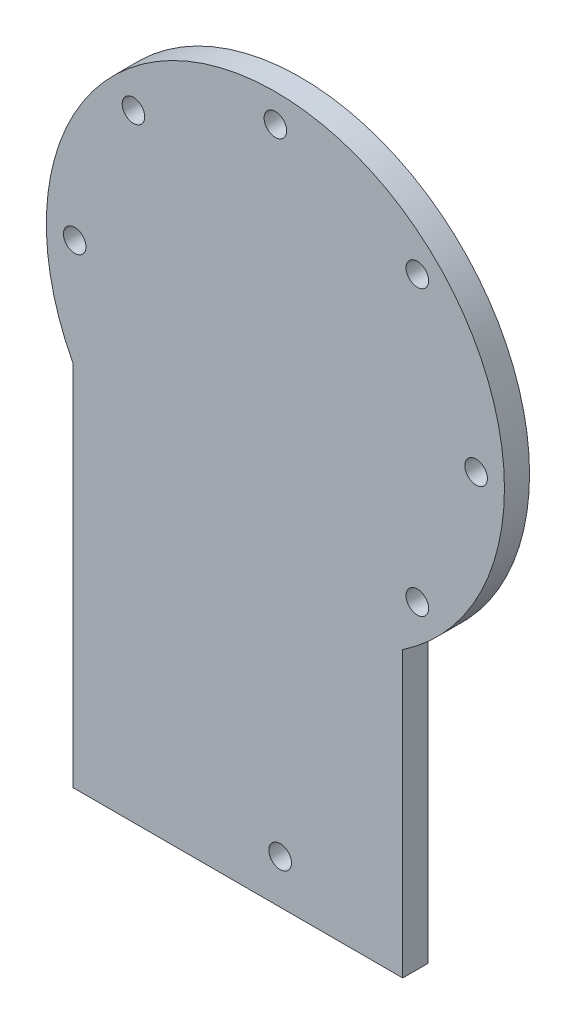
ISO-10303-21;
HEADER;
FILE_DESCRIPTION(('STEP AP214'),'2;1');
FILE_NAME('part.step','',(''),(''),'','','');
FILE_SCHEMA(('AUTOMOTIVE_DESIGN { 1 0 10303 214 1 1 1 1 }'));
ENDSEC;
DATA;
#1=APPLICATION_CONTEXT('core data for automotive mechanical design processes');
#2=APPLICATION_PROTOCOL_DEFINITION('international standard','automotive_design',2000,#1);
#3=PRODUCT_CONTEXT('',#1,'mechanical');
#4=PRODUCT('Part','Part','',(#3));
#5=PRODUCT_RELATED_PRODUCT_CATEGORY('part','',(#4));
#6=PRODUCT_DEFINITION_FORMATION('','',#4);
#7=PRODUCT_DEFINITION_CONTEXT('part definition',#1,'design');
#8=PRODUCT_DEFINITION('design','',#6,#7);
#9=PRODUCT_DEFINITION_SHAPE('','',#8);
#10=(LENGTH_UNIT() NAMED_UNIT(*) SI_UNIT(.MILLI.,.METRE.));
#11=(NAMED_UNIT(*) PLANE_ANGLE_UNIT() SI_UNIT($,.RADIAN.));
#12=(NAMED_UNIT(*) SI_UNIT($,.STERADIAN.) SOLID_ANGLE_UNIT());
#13=UNCERTAINTY_MEASURE_WITH_UNIT(LENGTH_MEASURE(1.E-05),#10,'distance_accuracy_value','');
#14=(GEOMETRIC_REPRESENTATION_CONTEXT(3) GLOBAL_UNCERTAINTY_ASSIGNED_CONTEXT((#13)) GLOBAL_UNIT_ASSIGNED_CONTEXT((#10,
#11,#12)) REPRESENTATION_CONTEXT('',''));
#15=CARTESIAN_POINT('',(0.,0.,0.));
#16=DIRECTION('',(0.,0.,1.));
#17=DIRECTION('',(1.,0.,0.));
#18=AXIS2_PLACEMENT_3D('',#15,#16,#17);
#19=CARTESIAN_POINT('',(-6.15000000000089,-6.15000000000047,2.));
#20=DIRECTION('',(0.,0.,-1.));
#21=DIRECTION('',(-1.,0.,0.));
#22=AXIS2_PLACEMENT_3D('',#19,#20,#21);
#23=CYLINDRICAL_SURFACE('',#22,18.2588849173052);
#24=CARTESIAN_POINT('',(-6.15000000000089,-6.15000000000047,0.));
#25=DIRECTION('',(0.,0.,1.));
#26=DIRECTION('',(1.,0.,0.));
#27=AXIS2_PLACEMENT_3D('',#24,#25,#26);
#28=CIRCLE('',#27,18.2588849173052);
#29=CARTESIAN_POINT('',(3.99999999999967,-21.3277593347437,0.));
#30=VERTEX_POINT('',#29);
#31=CARTESIAN_POINT('',(-22.3,-14.6684727752945,0.));
#32=VERTEX_POINT('',#31);
#33=EDGE_CURVE('E112',#30,#32,#28,.T.);
#34=ORIENTED_EDGE('',*,*,#33,.T.);
#35=DIRECTION('',(0.,0.,-1.));
#36=VECTOR('',#35,1.);
#37=CARTESIAN_POINT('',(-22.3,-14.6684727752945,2.));
#38=LINE('',#37,#36);
#39=CARTESIAN_POINT('',(-22.3,-14.6684727752945,2.));
#40=VERTEX_POINT('',#39);
#41=EDGE_CURVE('E11',#40,#32,#38,.T.);
#42=ORIENTED_EDGE('',*,*,#41,.F.);
#43=CARTESIAN_POINT('',(-6.15000000000089,-6.15000000000047,2.));
#44=DIRECTION('',(0.,0.,1.));
#45=DIRECTION('',(1.,0.,0.));
#46=AXIS2_PLACEMENT_3D('',#43,#44,#45);
#47=CIRCLE('',#46,18.2588849173052);
#48=CARTESIAN_POINT('',(3.99999999999967,-21.3277593347437,2.));
#49=VERTEX_POINT('',#48);
#50=EDGE_CURVE('E94',#49,#40,#47,.T.);
#51=ORIENTED_EDGE('',*,*,#50,.F.);
#52=DIRECTION('',(0.,0.,-1.));
#53=VECTOR('',#52,1.);
#54=CARTESIAN_POINT('',(3.99999999999967,-21.3277593347437,2.));
#55=LINE('',#54,#53);
#56=EDGE_CURVE('E108',#49,#30,#55,.T.);
#57=ORIENTED_EDGE('',*,*,#56,.T.);
#58=EDGE_LOOP('',(#34,#42,#51,#57));
#59=FACE_BOUND('',#58,.T.);
#60=ADVANCED_FACE('F39',(#59),#23,.T.);
#61=CARTESIAN_POINT('',(-22.3,-14.6684727752945,2.));
#62=DIRECTION('',(1.,0.,0.));
#63=DIRECTION('',(0.,1.,0.));
#64=AXIS2_PLACEMENT_3D('',#61,#62,#63);
#65=PLANE('',#64);
#66=DIRECTION('',(0.,-1.,0.));
#67=VECTOR('',#66,1.);
#68=CARTESIAN_POINT('',(-22.3,-14.6684727752945,0.));
#69=LINE('',#68,#67);
#70=CARTESIAN_POINT('',(-22.3,-44.,0.));
#71=VERTEX_POINT('',#70);
#72=EDGE_CURVE('E99',#32,#71,#69,.T.);
#73=ORIENTED_EDGE('',*,*,#72,.T.);
#74=DIRECTION('',(0.,0.,-1.));
#75=VECTOR('',#74,1.);
#76=CARTESIAN_POINT('',(-22.3,-44.,2.));
#77=LINE('',#76,#75);
#78=CARTESIAN_POINT('',(-22.3,-44.,2.));
#79=VERTEX_POINT('',#78);
#80=EDGE_CURVE('E47',#79,#71,#77,.T.);
#81=ORIENTED_EDGE('',*,*,#80,.F.);
#82=DIRECTION('',(0.,-1.,0.));
#83=VECTOR('',#82,1.);
#84=CARTESIAN_POINT('',(-22.3,-14.6684727752945,2.));
#85=LINE('',#84,#83);
#86=EDGE_CURVE('E88',#40,#79,#85,.T.);
#87=ORIENTED_EDGE('',*,*,#86,.F.);
#88=ORIENTED_EDGE('',*,*,#41,.T.);
#89=EDGE_LOOP('',(#73,#81,#87,#88));
#90=FACE_BOUND('',#89,.T.);
#91=ADVANCED_FACE('F98',(#90),#65,.F.);
#92=CARTESIAN_POINT('',(-22.3,-44.,2.));
#93=DIRECTION('',(0.,1.,0.));
#94=DIRECTION('',(0.,0.,1.));
#95=AXIS2_PLACEMENT_3D('',#92,#93,#94);
#96=PLANE('',#95);
#97=DIRECTION('',(1.,0.,0.));
#98=VECTOR('',#97,1.);
#99=CARTESIAN_POINT('',(-22.3,-44.,0.));
#100=LINE('',#99,#98);
#101=CARTESIAN_POINT('',(4.00000000000001,-44.,0.));
#102=VERTEX_POINT('',#101);
#103=EDGE_CURVE('E75',#71,#102,#100,.T.);
#104=ORIENTED_EDGE('',*,*,#103,.T.);
#105=DIRECTION('',(0.,0.,-1.));
#106=VECTOR('',#105,1.);
#107=CARTESIAN_POINT('',(4.00000000000001,-44.,2.));
#108=LINE('',#107,#106);
#109=CARTESIAN_POINT('',(4.00000000000001,-44.,2.));
#110=VERTEX_POINT('',#109);
#111=EDGE_CURVE('E101',#110,#102,#108,.T.);
#112=ORIENTED_EDGE('',*,*,#111,.F.);
#113=DIRECTION('',(1.,0.,0.));
#114=VECTOR('',#113,1.);
#115=CARTESIAN_POINT('',(-22.3,-44.,2.));
#116=LINE('',#115,#114);
#117=EDGE_CURVE('E92',#79,#110,#116,.T.);
#118=ORIENTED_EDGE('',*,*,#117,.F.);
#119=ORIENTED_EDGE('',*,*,#80,.T.);
#120=EDGE_LOOP('',(#104,#112,#118,#119));
#121=FACE_BOUND('',#120,.T.);
#122=ADVANCED_FACE('F102',(#121),#96,.F.);
#123=CARTESIAN_POINT('',(4.00000000000001,-44.,2.));
#124=DIRECTION('',(-1.,0.,0.));
#125=DIRECTION('',(0.,-1.,0.));
#126=AXIS2_PLACEMENT_3D('',#123,#124,#125);
#127=PLANE('',#126);
#128=DIRECTION('',(0.,1.,0.));
#129=VECTOR('',#128,1.);
#130=CARTESIAN_POINT('',(4.00000000000001,-44.,0.));
#131=LINE('',#130,#129);
#132=EDGE_CURVE('E81',#102,#30,#131,.T.);
#133=ORIENTED_EDGE('',*,*,#132,.T.);
#134=ORIENTED_EDGE('',*,*,#56,.F.);
#135=DIRECTION('',(0.,1.,0.));
#136=VECTOR('',#135,1.);
#137=CARTESIAN_POINT('',(4.00000000000001,-44.,2.));
#138=LINE('',#137,#136);
#139=EDGE_CURVE('E55',#110,#49,#138,.T.);
#140=ORIENTED_EDGE('',*,*,#139,.F.);
#141=ORIENTED_EDGE('',*,*,#111,.T.);
#142=EDGE_LOOP('',(#133,#134,#140,#141));
#143=FACE_BOUND('',#142,.T.);
#144=ADVANCED_FACE('F123',(#143),#127,.F.);
#145=CARTESIAN_POINT('',(-6.15000000000089,-6.15000000000047,2.));
#146=DIRECTION('',(0.,0.,1.));
#147=DIRECTION('',(1.,0.,0.));
#148=AXIS2_PLACEMENT_3D('',#145,#146,#147);
#149=PLANE('',#148);
#150=CARTESIAN_POINT('',(-5.76999999999976,-40.500000000001,2.));
#151=DIRECTION('',(0.,0.,-1.));
#152=DIRECTION('',(-1.,0.,0.));
#153=AXIS2_PLACEMENT_3D('',#150,#151,#152);
#154=CIRCLE('',#153,0.899999999999999);
#155=CARTESIAN_POINT('',(-6.66999999999976,-40.500000000001,2.));
#156=VERTEX_POINT('',#155);
#157=EDGE_CURVE('E165',#156,#156,#154,.T.);
#158=ORIENTED_EDGE('',*,*,#157,.T.);
#159=EDGE_LOOP('',(#158));
#160=FACE_BOUND('',#159,.T.);
#161=CARTESIAN_POINT('',(5.16370849898387,5.1637084989843,2.));
#162=DIRECTION('',(0.,0.,1.));
#163=DIRECTION('',(1.,0.,0.));
#164=AXIS2_PLACEMENT_3D('',#161,#162,#163);
#165=CIRCLE('',#164,0.9);
#166=CARTESIAN_POINT('',(6.06370849898387,5.1637084989843,2.));
#167=VERTEX_POINT('',#166);
#168=EDGE_CURVE('E162',#167,#167,#165,.T.);
#169=ORIENTED_EDGE('',*,*,#168,.F.);
#170=EDGE_LOOP('',(#169));
#171=FACE_BOUND('',#170,.T.);
#172=CARTESIAN_POINT('',(-6.15000000000089,9.84999999999954,2.));
#173=DIRECTION('',(0.,0.,1.));
#174=DIRECTION('',(1.,0.,0.));
#175=AXIS2_PLACEMENT_3D('',#172,#173,#174);
#176=CIRCLE('',#175,0.899999999999999);
#177=CARTESIAN_POINT('',(-5.25000000000089,9.84999999999954,2.));
#178=VERTEX_POINT('',#177);
#179=EDGE_CURVE('E155',#178,#178,#176,.T.);
#180=ORIENTED_EDGE('',*,*,#179,.F.);
#181=EDGE_LOOP('',(#180));
#182=FACE_BOUND('',#181,.T.);
#183=CARTESIAN_POINT('',(-17.4637084989856,5.1637084989843,2.));
#184=DIRECTION('',(0.,0.,1.));
#185=DIRECTION('',(1.,0.,0.));
#186=AXIS2_PLACEMENT_3D('',#183,#184,#185);
#187=CIRCLE('',#186,0.899999999999997);
#188=CARTESIAN_POINT('',(-16.5637084989857,5.1637084989843,2.));
#189=VERTEX_POINT('',#188);
#190=EDGE_CURVE('E149',#189,#189,#187,.T.);
#191=ORIENTED_EDGE('',*,*,#190,.F.);
#192=EDGE_LOOP('',(#191));
#193=FACE_BOUND('',#192,.T.);
#194=CARTESIAN_POINT('',(-22.1500000000009,-6.15000000000046,2.));
#195=DIRECTION('',(0.,0.,1.));
#196=DIRECTION('',(1.,0.,0.));
#197=AXIS2_PLACEMENT_3D('',#194,#195,#196);
#198=CIRCLE('',#197,0.899999999999997);
#199=CARTESIAN_POINT('',(-21.2500000000009,-6.15000000000046,2.));
#200=VERTEX_POINT('',#199);
#201=EDGE_CURVE('E143',#200,#200,#198,.T.);
#202=ORIENTED_EDGE('',*,*,#201,.F.);
#203=EDGE_LOOP('',(#202));
#204=FACE_BOUND('',#203,.T.);
#205=CARTESIAN_POINT('',(5.16370849898387,-17.4637084989852,2.));
#206=DIRECTION('',(0.,0.,1.));
#207=DIRECTION('',(1.,0.,0.));
#208=AXIS2_PLACEMENT_3D('',#205,#206,#207);
#209=CIRCLE('',#208,0.900000000000001);
#210=CARTESIAN_POINT('',(6.06370849898388,-17.4637084989852,2.));
#211=VERTEX_POINT('',#210);
#212=EDGE_CURVE('E137',#211,#211,#209,.T.);
#213=ORIENTED_EDGE('',*,*,#212,.F.);
#214=EDGE_LOOP('',(#213));
#215=FACE_BOUND('',#214,.T.);
#216=CARTESIAN_POINT('',(9.84999999999912,-6.15000000000047,2.));
#217=DIRECTION('',(0.,0.,1.));
#218=DIRECTION('',(1.,0.,0.));
#219=AXIS2_PLACEMENT_3D('',#216,#217,#218);
#220=CIRCLE('',#219,0.9);
#221=CARTESIAN_POINT('',(10.7499999999991,-6.15000000000047,2.));
#222=VERTEX_POINT('',#221);
#223=EDGE_CURVE('E131',#222,#222,#220,.T.);
#224=ORIENTED_EDGE('',*,*,#223,.F.);
#225=EDGE_LOOP('',(#224));
#226=FACE_BOUND('',#225,.T.);
#227=ORIENTED_EDGE('',*,*,#50,.T.);
#228=ORIENTED_EDGE('',*,*,#86,.T.);
#229=ORIENTED_EDGE('',*,*,#117,.T.);
#230=ORIENTED_EDGE('',*,*,#139,.T.);
#231=EDGE_LOOP('',(#227,#228,#229,#230));
#232=FACE_BOUND('',#231,.T.);
#233=ADVANCED_FACE('F90',(#160,#171,#182,#193,#204,#215,#226,#232),#149,.T.);
#234=CARTESIAN_POINT('',(-6.15000000000089,-6.15000000000047,0.));
#235=DIRECTION('',(0.,0.,1.));
#236=DIRECTION('',(1.,0.,0.));
#237=AXIS2_PLACEMENT_3D('',#234,#235,#236);
#238=PLANE('',#237);
#239=CARTESIAN_POINT('',(-5.76999999999976,-40.500000000001,0.));
#240=DIRECTION('',(0.,0.,-1.));
#241=DIRECTION('',(-1.,0.,0.));
#242=AXIS2_PLACEMENT_3D('',#239,#240,#241);
#243=CIRCLE('',#242,0.899999999999999);
#244=CARTESIAN_POINT('',(-6.66999999999976,-40.500000000001,0.));
#245=VERTEX_POINT('',#244);
#246=EDGE_CURVE('E168',#245,#245,#243,.T.);
#247=ORIENTED_EDGE('',*,*,#246,.F.);
#248=EDGE_LOOP('',(#247));
#249=FACE_BOUND('',#248,.T.);
#250=CARTESIAN_POINT('',(5.16370849898387,5.1637084989843,0.));
#251=DIRECTION('',(0.,0.,1.));
#252=DIRECTION('',(1.,0.,0.));
#253=AXIS2_PLACEMENT_3D('',#250,#251,#252);
#254=CIRCLE('',#253,0.9);
#255=CARTESIAN_POINT('',(6.06370849898387,5.1637084989843,0.));
#256=VERTEX_POINT('',#255);
#257=EDGE_CURVE('E159',#256,#256,#254,.T.);
#258=ORIENTED_EDGE('',*,*,#257,.T.);
#259=EDGE_LOOP('',(#258));
#260=FACE_BOUND('',#259,.T.);
#261=CARTESIAN_POINT('',(-6.15000000000089,9.84999999999954,0.));
#262=DIRECTION('',(0.,0.,1.));
#263=DIRECTION('',(1.,0.,0.));
#264=AXIS2_PLACEMENT_3D('',#261,#262,#263);
#265=CIRCLE('',#264,0.899999999999999);
#266=CARTESIAN_POINT('',(-5.25000000000089,9.84999999999954,0.));
#267=VERTEX_POINT('',#266);
#268=EDGE_CURVE('E152',#267,#267,#265,.T.);
#269=ORIENTED_EDGE('',*,*,#268,.T.);
#270=EDGE_LOOP('',(#269));
#271=FACE_BOUND('',#270,.T.);
#272=CARTESIAN_POINT('',(-17.4637084989856,5.1637084989843,0.));
#273=DIRECTION('',(0.,0.,1.));
#274=DIRECTION('',(1.,0.,0.));
#275=AXIS2_PLACEMENT_3D('',#272,#273,#274);
#276=CIRCLE('',#275,0.899999999999997);
#277=CARTESIAN_POINT('',(-16.5637084989857,5.1637084989843,0.));
#278=VERTEX_POINT('',#277);
#279=EDGE_CURVE('E146',#278,#278,#276,.T.);
#280=ORIENTED_EDGE('',*,*,#279,.T.);
#281=EDGE_LOOP('',(#280));
#282=FACE_BOUND('',#281,.T.);
#283=CARTESIAN_POINT('',(-22.1500000000009,-6.15000000000046,0.));
#284=DIRECTION('',(0.,0.,1.));
#285=DIRECTION('',(1.,0.,0.));
#286=AXIS2_PLACEMENT_3D('',#283,#284,#285);
#287=CIRCLE('',#286,0.899999999999997);
#288=CARTESIAN_POINT('',(-21.2500000000009,-6.15000000000046,0.));
#289=VERTEX_POINT('',#288);
#290=EDGE_CURVE('E140',#289,#289,#287,.T.);
#291=ORIENTED_EDGE('',*,*,#290,.T.);
#292=EDGE_LOOP('',(#291));
#293=FACE_BOUND('',#292,.T.);
#294=CARTESIAN_POINT('',(5.16370849898387,-17.4637084989852,0.));
#295=DIRECTION('',(0.,0.,1.));
#296=DIRECTION('',(1.,0.,0.));
#297=AXIS2_PLACEMENT_3D('',#294,#295,#296);
#298=CIRCLE('',#297,0.900000000000001);
#299=CARTESIAN_POINT('',(6.06370849898388,-17.4637084989852,0.));
#300=VERTEX_POINT('',#299);
#301=EDGE_CURVE('E134',#300,#300,#298,.T.);
#302=ORIENTED_EDGE('',*,*,#301,.T.);
#303=EDGE_LOOP('',(#302));
#304=FACE_BOUND('',#303,.T.);
#305=CARTESIAN_POINT('',(9.84999999999912,-6.15000000000047,0.));
#306=DIRECTION('',(0.,0.,1.));
#307=DIRECTION('',(1.,0.,0.));
#308=AXIS2_PLACEMENT_3D('',#305,#306,#307);
#309=CIRCLE('',#308,0.9);
#310=CARTESIAN_POINT('',(10.7499999999991,-6.15000000000047,0.));
#311=VERTEX_POINT('',#310);
#312=EDGE_CURVE('E116',#311,#311,#309,.T.);
#313=ORIENTED_EDGE('',*,*,#312,.T.);
#314=EDGE_LOOP('',(#313));
#315=FACE_BOUND('',#314,.T.);
#316=ORIENTED_EDGE('',*,*,#33,.F.);
#317=ORIENTED_EDGE('',*,*,#132,.F.);
#318=ORIENTED_EDGE('',*,*,#103,.F.);
#319=ORIENTED_EDGE('',*,*,#72,.F.);
#320=EDGE_LOOP('',(#316,#317,#318,#319));
#321=FACE_BOUND('',#320,.T.);
#322=ADVANCED_FACE('F126',(#249,#260,#271,#282,#293,#304,#315,#321),#238,.F.);
#323=CARTESIAN_POINT('',(9.84999999999912,-6.15000000000047,0.));
#324=DIRECTION('',(0.,0.,1.));
#325=DIRECTION('',(1.,0.,0.));
#326=AXIS2_PLACEMENT_3D('',#323,#324,#325);
#327=CYLINDRICAL_SURFACE('',#326,0.9);
#328=ORIENTED_EDGE('',*,*,#312,.F.);
#329=EDGE_LOOP('',(#328));
#330=FACE_BOUND('',#329,.T.);
#331=ORIENTED_EDGE('',*,*,#223,.T.);
#332=EDGE_LOOP('',(#331));
#333=FACE_BOUND('',#332,.T.);
#334=ADVANCED_FACE('F187',(#330,#333),#327,.F.);
#335=CARTESIAN_POINT('',(5.16370849898387,-17.4637084989852,0.));
#336=DIRECTION('',(0.,0.,1.));
#337=DIRECTION('',(1.,0.,0.));
#338=AXIS2_PLACEMENT_3D('',#335,#336,#337);
#339=CYLINDRICAL_SURFACE('',#338,0.900000000000001);
#340=ORIENTED_EDGE('',*,*,#301,.F.);
#341=EDGE_LOOP('',(#340));
#342=FACE_BOUND('',#341,.T.);
#343=ORIENTED_EDGE('',*,*,#212,.T.);
#344=EDGE_LOOP('',(#343));
#345=FACE_BOUND('',#344,.T.);
#346=ADVANCED_FACE('F203',(#342,#345),#339,.F.);
#347=CARTESIAN_POINT('',(-22.1500000000009,-6.15000000000046,0.));
#348=DIRECTION('',(0.,0.,1.));
#349=DIRECTION('',(1.,0.,0.));
#350=AXIS2_PLACEMENT_3D('',#347,#348,#349);
#351=CYLINDRICAL_SURFACE('',#350,0.899999999999997);
#352=ORIENTED_EDGE('',*,*,#290,.F.);
#353=EDGE_LOOP('',(#352));
#354=FACE_BOUND('',#353,.T.);
#355=ORIENTED_EDGE('',*,*,#201,.T.);
#356=EDGE_LOOP('',(#355));
#357=FACE_BOUND('',#356,.T.);
#358=ADVANCED_FACE('F249',(#354,#357),#351,.F.);
#359=CARTESIAN_POINT('',(-17.4637084989856,5.1637084989843,0.));
#360=DIRECTION('',(0.,0.,1.));
#361=DIRECTION('',(1.,0.,0.));
#362=AXIS2_PLACEMENT_3D('',#359,#360,#361);
#363=CYLINDRICAL_SURFACE('',#362,0.899999999999997);
#364=ORIENTED_EDGE('',*,*,#279,.F.);
#365=EDGE_LOOP('',(#364));
#366=FACE_BOUND('',#365,.T.);
#367=ORIENTED_EDGE('',*,*,#190,.T.);
#368=EDGE_LOOP('',(#367));
#369=FACE_BOUND('',#368,.T.);
#370=ADVANCED_FACE('F241',(#366,#369),#363,.F.);
#371=CARTESIAN_POINT('',(-6.15000000000089,9.84999999999954,0.));
#372=DIRECTION('',(0.,0.,1.));
#373=DIRECTION('',(1.,0.,0.));
#374=AXIS2_PLACEMENT_3D('',#371,#372,#373);
#375=CYLINDRICAL_SURFACE('',#374,0.899999999999999);
#376=ORIENTED_EDGE('',*,*,#268,.F.);
#377=EDGE_LOOP('',(#376));
#378=FACE_BOUND('',#377,.T.);
#379=ORIENTED_EDGE('',*,*,#179,.T.);
#380=EDGE_LOOP('',(#379));
#381=FACE_BOUND('',#380,.T.);
#382=ADVANCED_FACE('F233',(#378,#381),#375,.F.);
#383=CARTESIAN_POINT('',(5.16370849898387,5.1637084989843,0.));
#384=DIRECTION('',(0.,0.,1.));
#385=DIRECTION('',(1.,0.,0.));
#386=AXIS2_PLACEMENT_3D('',#383,#384,#385);
#387=CYLINDRICAL_SURFACE('',#386,0.9);
#388=ORIENTED_EDGE('',*,*,#257,.F.);
#389=EDGE_LOOP('',(#388));
#390=FACE_BOUND('',#389,.T.);
#391=ORIENTED_EDGE('',*,*,#168,.T.);
#392=EDGE_LOOP('',(#391));
#393=FACE_BOUND('',#392,.T.);
#394=ADVANCED_FACE('F181',(#390,#393),#387,.F.);
#395=CARTESIAN_POINT('',(-5.76999999999976,-40.500000000001,2.));
#396=DIRECTION('',(0.,0.,-1.));
#397=DIRECTION('',(-1.,0.,0.));
#398=AXIS2_PLACEMENT_3D('',#395,#396,#397);
#399=CYLINDRICAL_SURFACE('',#398,0.899999999999999);
#400=ORIENTED_EDGE('',*,*,#157,.F.);
#401=EDGE_LOOP('',(#400));
#402=FACE_BOUND('',#401,.T.);
#403=ORIENTED_EDGE('',*,*,#246,.T.);
#404=EDGE_LOOP('',(#403));
#405=FACE_BOUND('',#404,.T.);
#406=ADVANCED_FACE('F178',(#402,#405),#399,.F.);
#407=CLOSED_SHELL('',(#60,#91,#122,#144,#233,#322,#334,#346,#358,#370,#382,#394,#406));
#408=MANIFOLD_SOLID_BREP('B2',#407);
#409=ADVANCED_BREP_SHAPE_REPRESENTATION('',(#18,#408),#14);
#410=SHAPE_DEFINITION_REPRESENTATION(#9,#409);
ENDSEC;
END-ISO-10303-21;
